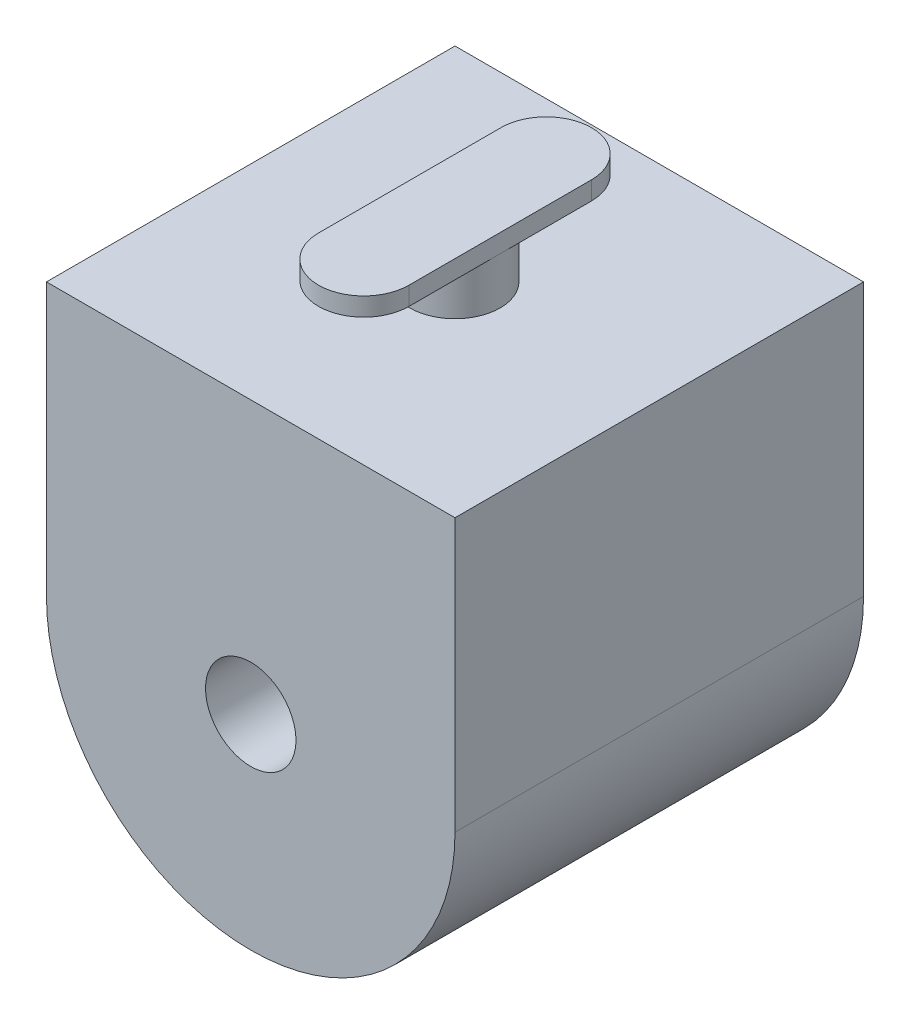
ISO-10303-21;
HEADER;
FILE_DESCRIPTION(('STEP AP214'),'2;1');
FILE_NAME('part.step','',(''),(''),'','','');
FILE_SCHEMA(('AUTOMOTIVE_DESIGN { 1 0 10303 214 1 1 1 1 }'));
ENDSEC;
DATA;
#1=APPLICATION_CONTEXT('core data for automotive mechanical design processes');
#2=APPLICATION_PROTOCOL_DEFINITION('international standard','automotive_design',2000,#1);
#3=PRODUCT_CONTEXT('',#1,'mechanical');
#4=PRODUCT('Part','Part','',(#3));
#5=PRODUCT_RELATED_PRODUCT_CATEGORY('part','',(#4));
#6=PRODUCT_DEFINITION_FORMATION('','',#4);
#7=PRODUCT_DEFINITION_CONTEXT('part definition',#1,'design');
#8=PRODUCT_DEFINITION('design','',#6,#7);
#9=PRODUCT_DEFINITION_SHAPE('','',#8);
#10=(LENGTH_UNIT() NAMED_UNIT(*) SI_UNIT(.MILLI.,.METRE.));
#11=(NAMED_UNIT(*) PLANE_ANGLE_UNIT() SI_UNIT($,.RADIAN.));
#12=(NAMED_UNIT(*) SI_UNIT($,.STERADIAN.) SOLID_ANGLE_UNIT());
#13=UNCERTAINTY_MEASURE_WITH_UNIT(LENGTH_MEASURE(1.E-05),#10,'distance_accuracy_value','');
#14=(GEOMETRIC_REPRESENTATION_CONTEXT(3) GLOBAL_UNCERTAINTY_ASSIGNED_CONTEXT((#13)) GLOBAL_UNIT_ASSIGNED_CONTEXT((#10,
#11,#12)) REPRESENTATION_CONTEXT('',''));
#15=CARTESIAN_POINT('',(0.,0.,0.));
#16=DIRECTION('',(0.,0.,1.));
#17=DIRECTION('',(1.,0.,0.));
#18=AXIS2_PLACEMENT_3D('',#15,#16,#17);
#19=CARTESIAN_POINT('',(0.,18.796,19.05));
#20=DIRECTION('',(0.,-1.,0.));
#21=DIRECTION('',(0.,0.,-1.));
#22=AXIS2_PLACEMENT_3D('',#19,#20,#21);
#23=CYLINDRICAL_SURFACE('',#22,4.2164);
#24=CARTESIAN_POINT('',(0.,12.7,19.05));
#25=DIRECTION('',(0.,1.,0.));
#26=DIRECTION('',(0.,0.,1.));
#27=AXIS2_PLACEMENT_3D('',#24,#25,#26);
#28=CIRCLE('',#27,4.2164);
#29=CARTESIAN_POINT('',(0.,12.7,23.2664));
#30=VERTEX_POINT('',#29);
#31=EDGE_CURVE('E180',#30,#30,#28,.T.);
#32=ORIENTED_EDGE('',*,*,#31,.T.);
#33=EDGE_LOOP('',(#32));
#34=FACE_BOUND('',#33,.T.);
#35=CARTESIAN_POINT('',(0.,17.0815,19.05));
#36=DIRECTION('',(0.,1.,0.));
#37=DIRECTION('',(0.,0.,1.));
#38=AXIS2_PLACEMENT_3D('',#35,#36,#37);
#39=CIRCLE('',#38,4.2164);
#40=CARTESIAN_POINT('',(4.2164,17.0815,19.05));
#41=VERTEX_POINT('',#40);
#42=CARTESIAN_POINT('',(-4.2164,17.0815,19.05));
#43=VERTEX_POINT('',#42);
#44=EDGE_CURVE('E11',#41,#43,#39,.T.);
#45=ORIENTED_EDGE('',*,*,#44,.F.);
#46=EDGE_CURVE('E47',#43,#41,#39,.T.);
#47=ORIENTED_EDGE('',*,*,#46,.F.);
#48=EDGE_LOOP('',(#45,#47));
#49=FACE_BOUND('',#48,.T.);
#50=ADVANCED_FACE('F43',(#34,#49),#23,.T.);
#51=CARTESIAN_POINT('',(-19.05,-12.7,38.1));
#52=DIRECTION('',(-1.,0.,0.));
#53=DIRECTION('',(0.,0.,1.));
#54=AXIS2_PLACEMENT_3D('',#51,#52,#53);
#55=PLANE('',#54);
#56=DIRECTION('',(0.,1.,0.));
#57=VECTOR('',#56,1.);
#58=CARTESIAN_POINT('',(-19.05,-12.7,0.));
#59=LINE('',#58,#57);
#60=CARTESIAN_POINT('',(-19.05,-12.7,0.));
#61=VERTEX_POINT('',#60);
#62=CARTESIAN_POINT('',(-19.05,12.7,0.));
#63=VERTEX_POINT('',#62);
#64=EDGE_CURVE('E188',#61,#63,#59,.T.);
#65=ORIENTED_EDGE('',*,*,#64,.F.);
#66=DIRECTION('',(0.,0.,-1.));
#67=VECTOR('',#66,1.);
#68=CARTESIAN_POINT('',(-19.05,-12.7,38.1));
#69=LINE('',#68,#67);
#70=CARTESIAN_POINT('',(-19.05,-12.7,38.1));
#71=VERTEX_POINT('',#70);
#72=EDGE_CURVE('E65',#71,#61,#69,.T.);
#73=ORIENTED_EDGE('',*,*,#72,.F.);
#74=DIRECTION('',(0.,1.,0.));
#75=VECTOR('',#74,1.);
#76=CARTESIAN_POINT('',(-19.05,-12.7,38.1));
#77=LINE('',#76,#75);
#78=CARTESIAN_POINT('',(-19.05,12.7,38.1));
#79=VERTEX_POINT('',#78);
#80=EDGE_CURVE('E192',#71,#79,#77,.T.);
#81=ORIENTED_EDGE('',*,*,#80,.T.);
#82=DIRECTION('',(0.,0.,-1.));
#83=VECTOR('',#82,1.);
#84=CARTESIAN_POINT('',(-19.05,12.7,38.1));
#85=LINE('',#84,#83);
#86=EDGE_CURVE('E90',#79,#63,#85,.T.);
#87=ORIENTED_EDGE('',*,*,#86,.T.);
#88=EDGE_LOOP('',(#65,#73,#81,#87));
#89=FACE_BOUND('',#88,.T.);
#90=ADVANCED_FACE('F45',(#89),#55,.T.);
#91=CARTESIAN_POINT('',(0.,-12.7,38.1));
#92=DIRECTION('',(0.,0.,-1.));
#93=DIRECTION('',(-1.,0.,0.));
#94=AXIS2_PLACEMENT_3D('',#91,#92,#93);
#95=CYLINDRICAL_SURFACE('',#94,19.05);
#96=CARTESIAN_POINT('',(0.,-12.7,0.));
#97=DIRECTION('',(0.,0.,1.));
#98=DIRECTION('',(1.,0.,0.));
#99=AXIS2_PLACEMENT_3D('',#96,#97,#98);
#100=CIRCLE('',#99,19.05);
#101=CARTESIAN_POINT('',(19.05,-12.7,0.));
#102=VERTEX_POINT('',#101);
#103=EDGE_CURVE('E196',#61,#102,#100,.T.);
#104=ORIENTED_EDGE('',*,*,#103,.T.);
#105=DIRECTION('',(0.,0.,-1.));
#106=VECTOR('',#105,1.);
#107=CARTESIAN_POINT('',(19.05,-12.7,38.1));
#108=LINE('',#107,#106);
#109=CARTESIAN_POINT('',(19.05,-12.7,38.1));
#110=VERTEX_POINT('',#109);
#111=EDGE_CURVE('E220',#110,#102,#108,.T.);
#112=ORIENTED_EDGE('',*,*,#111,.F.);
#113=CARTESIAN_POINT('',(0.,-12.7,38.1));
#114=DIRECTION('',(0.,0.,1.));
#115=DIRECTION('',(1.,0.,0.));
#116=AXIS2_PLACEMENT_3D('',#113,#114,#115);
#117=CIRCLE('',#116,19.05);
#118=EDGE_CURVE('E202',#71,#110,#117,.T.);
#119=ORIENTED_EDGE('',*,*,#118,.F.);
#120=ORIENTED_EDGE('',*,*,#72,.T.);
#121=EDGE_LOOP('',(#104,#112,#119,#120));
#122=FACE_BOUND('',#121,.T.);
#123=ADVANCED_FACE('F234',(#122),#95,.T.);
#124=CARTESIAN_POINT('',(19.05,-12.7,38.1));
#125=DIRECTION('',(-1.,0.,0.));
#126=DIRECTION('',(0.,0.,1.));
#127=AXIS2_PLACEMENT_3D('',#124,#125,#126);
#128=PLANE('',#127);
#129=DIRECTION('',(0.,1.,0.));
#130=VECTOR('',#129,1.);
#131=CARTESIAN_POINT('',(19.05,-12.7,0.));
#132=LINE('',#131,#130);
#133=CARTESIAN_POINT('',(19.05,12.7,0.));
#134=VERTEX_POINT('',#133);
#135=EDGE_CURVE('E212',#102,#134,#132,.T.);
#136=ORIENTED_EDGE('',*,*,#135,.T.);
#137=DIRECTION('',(0.,0.,-1.));
#138=VECTOR('',#137,1.);
#139=CARTESIAN_POINT('',(19.05,12.7,38.1));
#140=LINE('',#139,#138);
#141=CARTESIAN_POINT('',(19.05,12.7,38.1));
#142=VERTEX_POINT('',#141);
#143=EDGE_CURVE('E224',#142,#134,#140,.T.);
#144=ORIENTED_EDGE('',*,*,#143,.F.);
#145=DIRECTION('',(0.,1.,0.));
#146=VECTOR('',#145,1.);
#147=CARTESIAN_POINT('',(19.05,-12.7,38.1));
#148=LINE('',#147,#146);
#149=EDGE_CURVE('E199',#110,#142,#148,.T.);
#150=ORIENTED_EDGE('',*,*,#149,.F.);
#151=ORIENTED_EDGE('',*,*,#111,.T.);
#152=EDGE_LOOP('',(#136,#144,#150,#151));
#153=FACE_BOUND('',#152,.T.);
#154=ADVANCED_FACE('F237',(#153),#128,.F.);
#155=CARTESIAN_POINT('',(-19.05,12.7,38.1));
#156=DIRECTION('',(0.,1.,0.));
#157=DIRECTION('',(0.,0.,1.));
#158=AXIS2_PLACEMENT_3D('',#155,#156,#157);
#159=PLANE('',#158);
#160=ORIENTED_EDGE('',*,*,#31,.F.);
#161=EDGE_LOOP('',(#160));
#162=FACE_BOUND('',#161,.T.);
#163=DIRECTION('',(1.,0.,0.));
#164=VECTOR('',#163,1.);
#165=CARTESIAN_POINT('',(-19.05,12.7,0.));
#166=LINE('',#165,#164);
#167=EDGE_CURVE('E208',#63,#134,#166,.T.);
#168=ORIENTED_EDGE('',*,*,#167,.F.);
#169=ORIENTED_EDGE('',*,*,#86,.F.);
#170=DIRECTION('',(1.,0.,0.));
#171=VECTOR('',#170,1.);
#172=CARTESIAN_POINT('',(-19.05,12.7,38.1));
#173=LINE('',#172,#171);
#174=EDGE_CURVE('E195',#79,#142,#173,.T.);
#175=ORIENTED_EDGE('',*,*,#174,.T.);
#176=ORIENTED_EDGE('',*,*,#143,.T.);
#177=EDGE_LOOP('',(#168,#169,#175,#176));
#178=FACE_BOUND('',#177,.T.);
#179=ADVANCED_FACE('F228',(#162,#178),#159,.T.);
#180=CARTESIAN_POINT('',(0.,-12.7,38.1));
#181=DIRECTION('',(0.,0.,1.));
#182=DIRECTION('',(1.,0.,0.));
#183=AXIS2_PLACEMENT_3D('',#180,#181,#182);
#184=PLANE('',#183);
#185=CARTESIAN_POINT('',(0.,-12.7,38.1));
#186=DIRECTION('',(0.,0.,-1.));
#187=DIRECTION('',(-1.,0.,0.));
#188=AXIS2_PLACEMENT_3D('',#185,#186,#187);
#189=CIRCLE('',#188,4.2164);
#190=CARTESIAN_POINT('',(-4.2164,-12.7,38.1));
#191=VERTEX_POINT('',#190);
#192=EDGE_CURVE('E184',#191,#191,#189,.T.);
#193=ORIENTED_EDGE('',*,*,#192,.T.);
#194=EDGE_LOOP('',(#193));
#195=FACE_BOUND('',#194,.T.);
#196=ORIENTED_EDGE('',*,*,#80,.F.);
#197=ORIENTED_EDGE('',*,*,#118,.T.);
#198=ORIENTED_EDGE('',*,*,#149,.T.);
#199=ORIENTED_EDGE('',*,*,#174,.F.);
#200=EDGE_LOOP('',(#196,#197,#198,#199));
#201=FACE_BOUND('',#200,.T.);
#202=ADVANCED_FACE('F239',(#195,#201),#184,.T.);
#203=CARTESIAN_POINT('',(0.,-12.7,0.));
#204=DIRECTION('',(0.,0.,1.));
#205=DIRECTION('',(1.,0.,0.));
#206=AXIS2_PLACEMENT_3D('',#203,#204,#205);
#207=PLANE('',#206);
#208=CARTESIAN_POINT('',(0.,-12.7,0.));
#209=DIRECTION('',(0.,0.,-1.));
#210=DIRECTION('',(-1.,0.,0.));
#211=AXIS2_PLACEMENT_3D('',#208,#209,#210);
#212=CIRCLE('',#211,4.2164);
#213=CARTESIAN_POINT('',(-4.2164,-12.7,0.));
#214=VERTEX_POINT('',#213);
#215=EDGE_CURVE('E174',#214,#214,#212,.T.);
#216=ORIENTED_EDGE('',*,*,#215,.F.);
#217=EDGE_LOOP('',(#216));
#218=FACE_BOUND('',#217,.T.);
#219=ORIENTED_EDGE('',*,*,#64,.T.);
#220=ORIENTED_EDGE('',*,*,#167,.T.);
#221=ORIENTED_EDGE('',*,*,#135,.F.);
#222=ORIENTED_EDGE('',*,*,#103,.F.);
#223=EDGE_LOOP('',(#219,#220,#221,#222));
#224=FACE_BOUND('',#223,.T.);
#225=ADVANCED_FACE('F232',(#218,#224),#207,.F.);
#226=CARTESIAN_POINT('',(0.,-12.7,38.1));
#227=DIRECTION('',(0.,0.,-1.));
#228=DIRECTION('',(-1.,0.,0.));
#229=AXIS2_PLACEMENT_3D('',#226,#227,#228);
#230=CYLINDRICAL_SURFACE('',#229,4.2164);
#231=CARTESIAN_POINT('',(-4.2164,-12.7,38.1));
#232=CARTESIAN_POINT('',(-4.2164,-12.7,37.703125));
#233=CARTESIAN_POINT('',(-4.2164,-12.7,37.30625));
#234=CARTESIAN_POINT('',(-4.2164,-12.7,36.5125));
#235=CARTESIAN_POINT('',(-4.2164,-12.7,36.115625));
#236=CARTESIAN_POINT('',(-4.2164,-12.7,35.321875));
#237=CARTESIAN_POINT('',(-4.2164,-12.7,34.925));
#238=CARTESIAN_POINT('',(-4.2164,-12.7,34.13125));
#239=CARTESIAN_POINT('',(-4.2164,-12.7,33.734375));
#240=CARTESIAN_POINT('',(-4.2164,-12.7,32.940625));
#241=CARTESIAN_POINT('',(-4.2164,-12.7,32.54375));
#242=CARTESIAN_POINT('',(-4.2164,-12.7,31.75));
#243=CARTESIAN_POINT('',(-4.2164,-12.7,31.353125));
#244=CARTESIAN_POINT('',(-4.2164,-12.7,30.559375));
#245=CARTESIAN_POINT('',(-4.2164,-12.7,30.1625));
#246=CARTESIAN_POINT('',(-4.2164,-12.7,29.36875));
#247=CARTESIAN_POINT('',(-4.2164,-12.7,28.971875));
#248=CARTESIAN_POINT('',(-4.2164,-12.7,28.178125));
#249=CARTESIAN_POINT('',(-4.2164,-12.7,27.78125));
#250=CARTESIAN_POINT('',(-4.2164,-12.7,26.9875));
#251=CARTESIAN_POINT('',(-4.2164,-12.7,26.590625));
#252=CARTESIAN_POINT('',(-4.2164,-12.7,25.796875));
#253=CARTESIAN_POINT('',(-4.2164,-12.7,25.4));
#254=CARTESIAN_POINT('',(-4.2164,-12.7,24.60625));
#255=CARTESIAN_POINT('',(-4.2164,-12.7,24.209375));
#256=CARTESIAN_POINT('',(-4.2164,-12.7,23.415625));
#257=CARTESIAN_POINT('',(-4.2164,-12.7,23.01875));
#258=CARTESIAN_POINT('',(-4.2164,-12.7,22.225));
#259=CARTESIAN_POINT('',(-4.2164,-12.7,21.828125));
#260=CARTESIAN_POINT('',(-4.2164,-12.7,21.034375));
#261=CARTESIAN_POINT('',(-4.2164,-12.7,20.6375));
#262=CARTESIAN_POINT('',(-4.2164,-12.7,19.84375));
#263=CARTESIAN_POINT('',(-4.2164,-12.7,19.446875));
#264=CARTESIAN_POINT('',(-4.2164,-12.7,18.653125));
#265=CARTESIAN_POINT('',(-4.2164,-12.7,18.25625));
#266=CARTESIAN_POINT('',(-4.2164,-12.7,17.4625));
#267=CARTESIAN_POINT('',(-4.2164,-12.7,17.065625));
#268=CARTESIAN_POINT('',(-4.2164,-12.7,16.271875));
#269=CARTESIAN_POINT('',(-4.2164,-12.7,15.875));
#270=CARTESIAN_POINT('',(-4.2164,-12.7,15.08125));
#271=CARTESIAN_POINT('',(-4.2164,-12.7,14.684375));
#272=CARTESIAN_POINT('',(-4.2164,-12.7,13.890625));
#273=CARTESIAN_POINT('',(-4.2164,-12.7,13.49375));
#274=CARTESIAN_POINT('',(-4.2164,-12.7,12.7));
#275=CARTESIAN_POINT('',(-4.2164,-12.7,12.303125));
#276=CARTESIAN_POINT('',(-4.2164,-12.7,11.509375));
#277=CARTESIAN_POINT('',(-4.2164,-12.7,11.1125));
#278=CARTESIAN_POINT('',(-4.2164,-12.7,10.31875));
#279=CARTESIAN_POINT('',(-4.2164,-12.7,9.921875));
#280=CARTESIAN_POINT('',(-4.2164,-12.7,9.128125));
#281=CARTESIAN_POINT('',(-4.2164,-12.7,8.73125));
#282=CARTESIAN_POINT('',(-4.2164,-12.7,7.9375));
#283=CARTESIAN_POINT('',(-4.2164,-12.7,7.540625));
#284=CARTESIAN_POINT('',(-4.2164,-12.7,6.746875));
#285=CARTESIAN_POINT('',(-4.2164,-12.7,6.35));
#286=CARTESIAN_POINT('',(-4.2164,-12.7,5.55625));
#287=CARTESIAN_POINT('',(-4.2164,-12.7,5.159375));
#288=CARTESIAN_POINT('',(-4.2164,-12.7,4.365625));
#289=CARTESIAN_POINT('',(-4.2164,-12.7,3.96875));
#290=CARTESIAN_POINT('',(-4.2164,-12.7,3.175));
#291=CARTESIAN_POINT('',(-4.2164,-12.7,2.778125));
#292=CARTESIAN_POINT('',(-4.2164,-12.7,1.984375));
#293=CARTESIAN_POINT('',(-4.2164,-12.7,1.5875));
#294=CARTESIAN_POINT('',(-4.2164,-12.7,0.79375));
#295=CARTESIAN_POINT('',(-4.2164,-12.7,0.396875));
#296=CARTESIAN_POINT('',(-4.2164,-12.7,0.));
#297=B_SPLINE_CURVE_WITH_KNOTS('',3,(#231,#232,#233,#234,#235,#236,#237,#238,#239,#240,#241,
#242,#243,#244,#245,#246,#247,#248,#249,#250,#251,#252,#253,#254,#255,#256,#257,#258,#259,#260,
#261,#262,#263,#264,#265,#266,#267,#268,#269,#270,#271,#272,#273,#274,#275,#276,#277,#278,#279,
#280,#281,#282,#283,#284,#285,#286,#287,#288,#289,#290,#291,#292,#293,#294,#295,#296),
.UNSPECIFIED.,.F.,.F.,(4,2,2,2,2,2,2,2,2,2,2,2,2,2,2,2,2,2,2,2,2,2,2,2,2,2,2,2,2,2,2,2,4),(0.,
1.190625,2.38125,3.571875,4.7625,5.953125,7.14375,8.334375,9.52500000000001,10.715625,11.90625,
13.096875,14.2875,15.478125,16.66875,17.859375,19.05,20.240625,21.43125,22.621875,23.8125,
25.003125,26.19375,27.384375,28.575,29.765625,30.95625,32.146875,33.3375,34.528125,35.71875,
36.909375,38.1),.UNSPECIFIED.);
#298=EDGE_CURVE('BSEAM247',#191,#214,#297,.T.);
#299=ORIENTED_EDGE('',*,*,#192,.F.);
#300=ORIENTED_EDGE('',*,*,#215,.T.);
#301=ORIENTED_EDGE('',*,*,#298,.T.);
#302=ORIENTED_EDGE('',*,*,#298,.F.);
#303=EDGE_LOOP('',(#299,#301,#300,#302));
#304=FACE_BOUND('',#303,.T.);
#305=ADVANCED_FACE('F247',(#304),#230,.F.);
#306=CARTESIAN_POINT('',(0.,17.0815,27.559));
#307=DIRECTION('',(0.,1.,0.));
#308=DIRECTION('',(0.,0.,1.));
#309=AXIS2_PLACEMENT_3D('',#306,#307,#308);
#310=PLANE('',#309);
#311=DIRECTION('',(0.,0.,-1.));
#312=VECTOR('',#311,1.);
#313=CARTESIAN_POINT('',(4.2164,17.0815,27.559));
#314=LINE('',#313,#312);
#315=CARTESIAN_POINT('',(4.2164,17.0815,10.541));
#316=VERTEX_POINT('',#315);
#317=EDGE_CURVE('E143',#41,#316,#314,.T.);
#318=ORIENTED_EDGE('',*,*,#317,.F.);
#319=ORIENTED_EDGE('',*,*,#44,.T.);
#320=DIRECTION('',(0.,0.,1.));
#321=VECTOR('',#320,1.);
#322=CARTESIAN_POINT('',(-4.2164,17.0815,27.559));
#323=LINE('',#322,#321);
#324=CARTESIAN_POINT('',(-4.2164,17.0815,10.541));
#325=VERTEX_POINT('',#324);
#326=EDGE_CURVE('E133',#325,#43,#323,.T.);
#327=ORIENTED_EDGE('',*,*,#326,.F.);
#328=CARTESIAN_POINT('',(0.,17.0815,10.541));
#329=DIRECTION('',(0.,1.,0.));
#330=DIRECTION('',(0.,0.,1.));
#331=AXIS2_PLACEMENT_3D('',#328,#329,#330);
#332=CIRCLE('',#331,4.2164);
#333=EDGE_CURVE('E142',#316,#325,#332,.T.);
#334=ORIENTED_EDGE('',*,*,#333,.F.);
#335=EDGE_LOOP('',(#318,#319,#327,#334));
#336=FACE_BOUND('',#335,.T.);
#337=ADVANCED_FACE('F262',(#336),#310,.F.);
#338=CARTESIAN_POINT('',(-4.2164,17.0815,27.559));
#339=DIRECTION('',(-1.,0.,0.));
#340=DIRECTION('',(0.,0.,1.));
#341=AXIS2_PLACEMENT_3D('',#338,#339,#340);
#342=PLANE('',#341);
#343=ORIENTED_EDGE('',*,*,#326,.T.);
#344=CARTESIAN_POINT('',(-4.2164,17.0815,27.559));
#345=VERTEX_POINT('',#344);
#346=EDGE_CURVE('E160',#43,#345,#323,.T.);
#347=ORIENTED_EDGE('',*,*,#346,.T.);
#348=DIRECTION('',(0.,1.,0.));
#349=VECTOR('',#348,1.);
#350=CARTESIAN_POINT('',(-4.2164,17.0815,27.559));
#351=LINE('',#350,#349);
#352=CARTESIAN_POINT('',(-4.2164,18.796,27.559));
#353=VERTEX_POINT('',#352);
#354=EDGE_CURVE('E148',#345,#353,#351,.T.);
#355=ORIENTED_EDGE('',*,*,#354,.T.);
#356=DIRECTION('',(0.,0.,1.));
#357=VECTOR('',#356,1.);
#358=CARTESIAN_POINT('',(-4.2164,18.796,27.559));
#359=LINE('',#358,#357);
#360=CARTESIAN_POINT('',(-4.2164,18.796,10.541));
#361=VERTEX_POINT('',#360);
#362=EDGE_CURVE('E150',#361,#353,#359,.T.);
#363=ORIENTED_EDGE('',*,*,#362,.F.);
#364=DIRECTION('',(0.,1.,0.));
#365=VECTOR('',#364,1.);
#366=CARTESIAN_POINT('',(-4.2164,17.0815,10.541));
#367=LINE('',#366,#365);
#368=EDGE_CURVE('E175',#325,#361,#367,.T.);
#369=ORIENTED_EDGE('',*,*,#368,.F.);
#370=EDGE_LOOP('',(#343,#347,#355,#363,#369));
#371=FACE_BOUND('',#370,.T.);
#372=ADVANCED_FACE('F267',(#371),#342,.T.);
#373=CARTESIAN_POINT('',(4.2164,17.0815,27.559));
#374=DIRECTION('',(1.,0.,0.));
#375=DIRECTION('',(0.,0.,-1.));
#376=AXIS2_PLACEMENT_3D('',#373,#374,#375);
#377=PLANE('',#376);
#378=CARTESIAN_POINT('',(4.2164,17.0815,27.559));
#379=VERTEX_POINT('',#378);
#380=EDGE_CURVE('E124',#379,#41,#314,.T.);
#381=ORIENTED_EDGE('',*,*,#380,.T.);
#382=ORIENTED_EDGE('',*,*,#317,.T.);
#383=DIRECTION('',(0.,1.,0.));
#384=VECTOR('',#383,1.);
#385=CARTESIAN_POINT('',(4.2164,17.0815,10.541));
#386=LINE('',#385,#384);
#387=CARTESIAN_POINT('',(4.2164,18.796,10.541));
#388=VERTEX_POINT('',#387);
#389=EDGE_CURVE('E132',#316,#388,#386,.T.);
#390=ORIENTED_EDGE('',*,*,#389,.T.);
#391=DIRECTION('',(0.,0.,-1.));
#392=VECTOR('',#391,1.);
#393=CARTESIAN_POINT('',(4.2164,18.796,27.559));
#394=LINE('',#393,#392);
#395=CARTESIAN_POINT('',(4.2164,18.796,27.559));
#396=VERTEX_POINT('',#395);
#397=EDGE_CURVE('E126',#396,#388,#394,.T.);
#398=ORIENTED_EDGE('',*,*,#397,.F.);
#399=DIRECTION('',(0.,1.,0.));
#400=VECTOR('',#399,1.);
#401=CARTESIAN_POINT('',(4.2164,17.0815,27.559));
#402=LINE('',#401,#400);
#403=EDGE_CURVE('E121',#379,#396,#402,.T.);
#404=ORIENTED_EDGE('',*,*,#403,.F.);
#405=EDGE_LOOP('',(#381,#382,#390,#398,#404));
#406=FACE_BOUND('',#405,.T.);
#407=ADVANCED_FACE('F123',(#406),#377,.T.);
#408=CARTESIAN_POINT('',(0.,17.0815,27.559));
#409=DIRECTION('',(0.,1.,0.));
#410=DIRECTION('',(0.,0.,1.));
#411=AXIS2_PLACEMENT_3D('',#408,#409,#410);
#412=CYLINDRICAL_SURFACE('',#411,4.2164);
#413=CARTESIAN_POINT('',(0.,18.796,27.559));
#414=DIRECTION('',(0.,1.,0.));
#415=DIRECTION('',(0.,0.,1.));
#416=AXIS2_PLACEMENT_3D('',#413,#414,#415);
#417=CIRCLE('',#416,4.2164);
#418=EDGE_CURVE('E164',#353,#396,#417,.T.);
#419=ORIENTED_EDGE('',*,*,#418,.F.);
#420=ORIENTED_EDGE('',*,*,#354,.F.);
#421=CARTESIAN_POINT('',(0.,17.0815,27.559));
#422=DIRECTION('',(0.,1.,0.));
#423=DIRECTION('',(0.,0.,1.));
#424=AXIS2_PLACEMENT_3D('',#421,#422,#423);
#425=CIRCLE('',#424,4.2164);
#426=EDGE_CURVE('E139',#345,#379,#425,.T.);
#427=ORIENTED_EDGE('',*,*,#426,.T.);
#428=ORIENTED_EDGE('',*,*,#403,.T.);
#429=EDGE_LOOP('',(#419,#420,#427,#428));
#430=FACE_BOUND('',#429,.T.);
#431=ADVANCED_FACE('F146',(#430),#412,.T.);
#432=CARTESIAN_POINT('',(0.,17.0815,10.541));
#433=DIRECTION('',(0.,1.,0.));
#434=DIRECTION('',(0.,0.,1.));
#435=AXIS2_PLACEMENT_3D('',#432,#433,#434);
#436=CYLINDRICAL_SURFACE('',#435,4.2164);
#437=CARTESIAN_POINT('',(0.,18.796,10.541));
#438=DIRECTION('',(0.,1.,0.));
#439=DIRECTION('',(0.,0.,1.));
#440=AXIS2_PLACEMENT_3D('',#437,#438,#439);
#441=CIRCLE('',#440,4.2164);
#442=EDGE_CURVE('E154',#388,#361,#441,.T.);
#443=ORIENTED_EDGE('',*,*,#442,.F.);
#444=ORIENTED_EDGE('',*,*,#389,.F.);
#445=ORIENTED_EDGE('',*,*,#333,.T.);
#446=ORIENTED_EDGE('',*,*,#368,.T.);
#447=EDGE_LOOP('',(#443,#444,#445,#446));
#448=FACE_BOUND('',#447,.T.);
#449=ADVANCED_FACE('F279',(#448),#436,.T.);
#450=ORIENTED_EDGE('',*,*,#346,.F.);
#451=ORIENTED_EDGE('',*,*,#46,.T.);
#452=ORIENTED_EDGE('',*,*,#380,.F.);
#453=ORIENTED_EDGE('',*,*,#426,.F.);
#454=EDGE_LOOP('',(#450,#451,#452,#453));
#455=FACE_BOUND('',#454,.T.);
#456=ADVANCED_FACE('F138',(#455),#310,.F.);
#457=CARTESIAN_POINT('',(0.,18.796,19.05));
#458=DIRECTION('',(0.,1.,0.));
#459=DIRECTION('',(0.,0.,1.));
#460=AXIS2_PLACEMENT_3D('',#457,#458,#459);
#461=PLANE('',#460);
#462=ORIENTED_EDGE('',*,*,#418,.T.);
#463=ORIENTED_EDGE('',*,*,#397,.T.);
#464=ORIENTED_EDGE('',*,*,#442,.T.);
#465=ORIENTED_EDGE('',*,*,#362,.T.);
#466=EDGE_LOOP('',(#462,#463,#464,#465));
#467=FACE_BOUND('',#466,.T.);
#468=ADVANCED_FACE('F259',(#467),#461,.T.);
#469=CLOSED_SHELL('',(#50,#90,#123,#154,#179,#202,#225,#305,#337,#372,#407,#431,#449,#456,#468));
#470=MANIFOLD_SOLID_BREP('B2',#469);
#471=ADVANCED_BREP_SHAPE_REPRESENTATION('',(#18,#470),#14);
#472=SHAPE_DEFINITION_REPRESENTATION(#9,#471);
ENDSEC;
END-ISO-10303-21;
